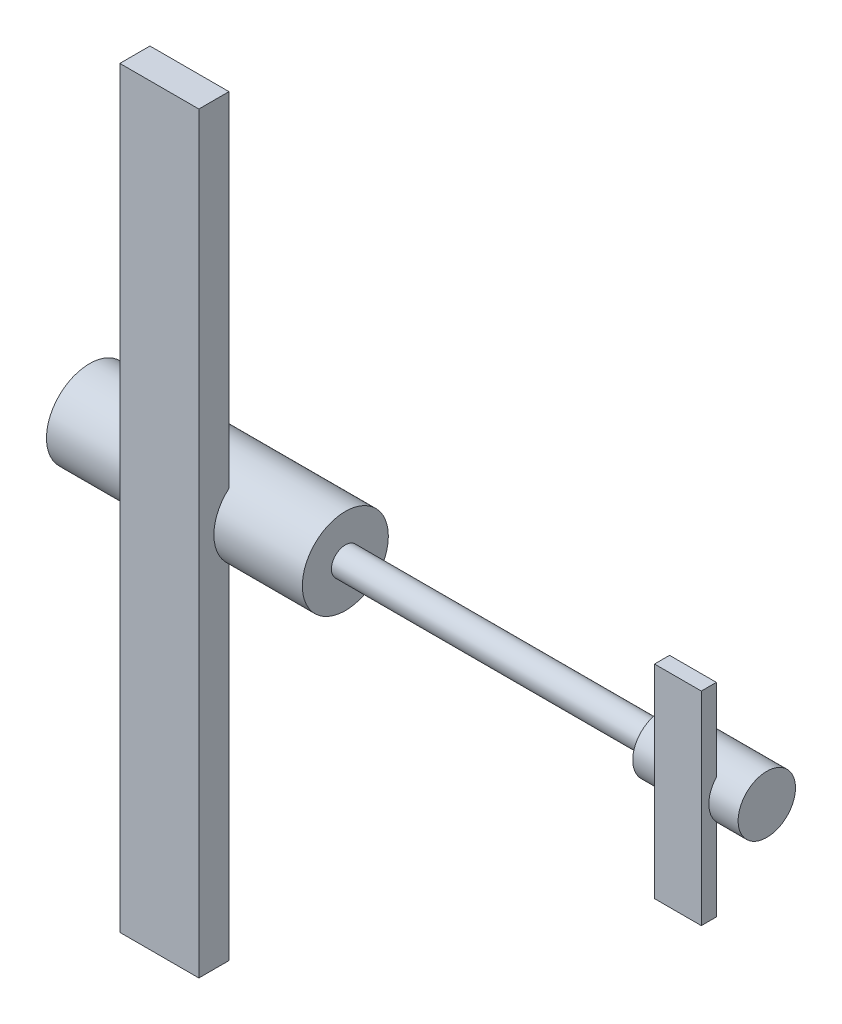
ISO-10303-21;
HEADER;
FILE_DESCRIPTION(('STEP AP214'),'2;1');
FILE_NAME('part.step','',(''),(''),'','','');
FILE_SCHEMA(('AUTOMOTIVE_DESIGN { 1 0 10303 214 1 1 1 1 }'));
ENDSEC;
DATA;
#1=APPLICATION_CONTEXT('core data for automotive mechanical design processes');
#2=APPLICATION_PROTOCOL_DEFINITION('international standard','automotive_design',2000,#1);
#3=PRODUCT_CONTEXT('',#1,'mechanical');
#4=PRODUCT('Part','Part','',(#3));
#5=PRODUCT_RELATED_PRODUCT_CATEGORY('part','',(#4));
#6=PRODUCT_DEFINITION_FORMATION('','',#4);
#7=PRODUCT_DEFINITION_CONTEXT('part definition',#1,'design');
#8=PRODUCT_DEFINITION('design','',#6,#7);
#9=PRODUCT_DEFINITION_SHAPE('','',#8);
#10=(LENGTH_UNIT() NAMED_UNIT(*) SI_UNIT(.MILLI.,.METRE.));
#11=(NAMED_UNIT(*) PLANE_ANGLE_UNIT() SI_UNIT($,.RADIAN.));
#12=(NAMED_UNIT(*) SI_UNIT($,.STERADIAN.) SOLID_ANGLE_UNIT());
#13=UNCERTAINTY_MEASURE_WITH_UNIT(LENGTH_MEASURE(1.E-05),#10,'distance_accuracy_value','');
#14=(GEOMETRIC_REPRESENTATION_CONTEXT(3) GLOBAL_UNCERTAINTY_ASSIGNED_CONTEXT((#13)) GLOBAL_UNIT_ASSIGNED_CONTEXT((#10,
#11,#12)) REPRESENTATION_CONTEXT('',''));
#15=CARTESIAN_POINT('',(0.,0.,0.));
#16=DIRECTION('',(0.,0.,1.));
#17=DIRECTION('',(1.,0.,0.));
#18=AXIS2_PLACEMENT_3D('',#15,#16,#17);
#19=CARTESIAN_POINT('',(900.,0.,0.));
#20=DIRECTION('',(-1.,0.,0.));
#21=DIRECTION('',(0.,0.,1.));
#22=AXIS2_PLACEMENT_3D('',#19,#20,#21);
#23=CYLINDRICAL_SURFACE('',#22,38.1);
#24=CARTESIAN_POINT('',(760.,0.,0.));
#25=DIRECTION('',(1.,0.,0.));
#26=DIRECTION('',(0.,0.,-1.));
#27=AXIS2_PLACEMENT_3D('',#24,#25,#26);
#28=CIRCLE('',#27,38.1);
#29=CARTESIAN_POINT('',(760.,0.,-38.1));
#30=VERTEX_POINT('',#29);
#31=EDGE_CURVE('E210',#30,#30,#28,.T.);
#32=ORIENTED_EDGE('',*,*,#31,.T.);
#33=EDGE_LOOP('',(#32));
#34=FACE_BOUND('',#33,.T.);
#35=CARTESIAN_POINT('',(900.,0.,0.));
#36=DIRECTION('',(1.,0.,0.));
#37=DIRECTION('',(0.,0.,-1.));
#38=AXIS2_PLACEMENT_3D('',#35,#36,#37);
#39=CIRCLE('',#38,38.1);
#40=CARTESIAN_POINT('',(900.,0.,-38.1));
#41=VERTEX_POINT('',#40);
#42=EDGE_CURVE('E211',#41,#41,#39,.T.);
#43=ORIENTED_EDGE('',*,*,#42,.F.);
#44=EDGE_LOOP('',(#43));
#45=FACE_BOUND('',#44,.T.);
#46=DIRECTION('',(-1.,0.,0.));
#47=VECTOR('',#46,1.);
#48=CARTESIAN_POINT('',(900.,25.7293606605372,28.1000000000001));
#49=LINE('',#48,#47);
#50=CARTESIAN_POINT('',(861.1,25.7293606605372,28.1000000000001));
#51=VERTEX_POINT('',#50);
#52=CARTESIAN_POINT('',(798.9,25.7293606605372,28.1000000000001));
#53=VERTEX_POINT('',#52);
#54=EDGE_CURVE('E11',#51,#53,#49,.T.);
#55=ORIENTED_EDGE('',*,*,#54,.F.);
#56=CARTESIAN_POINT('',(861.1,0.,0.));
#57=DIRECTION('',(-1.,0.,0.));
#58=DIRECTION('',(0.,0.,1.));
#59=AXIS2_PLACEMENT_3D('',#56,#57,#58);
#60=CIRCLE('',#59,38.1);
#61=CARTESIAN_POINT('',(861.1,-25.7293606605372,28.1000000000001));
#62=VERTEX_POINT('',#61);
#63=EDGE_CURVE('E254',#62,#51,#60,.T.);
#64=ORIENTED_EDGE('',*,*,#63,.F.);
#65=DIRECTION('',(-1.,0.,0.));
#66=VECTOR('',#65,1.);
#67=CARTESIAN_POINT('',(900.,-25.7293606605372,28.1000000000001));
#68=LINE('',#67,#66);
#69=CARTESIAN_POINT('',(798.9,-25.7293606605372,28.1000000000001));
#70=VERTEX_POINT('',#69);
#71=EDGE_CURVE('E250',#70,#62,#68,.F.);
#72=ORIENTED_EDGE('',*,*,#71,.F.);
#73=CARTESIAN_POINT('',(798.9,0.,0.));
#74=DIRECTION('',(1.,0.,0.));
#75=DIRECTION('',(0.,0.,-1.));
#76=AXIS2_PLACEMENT_3D('',#73,#74,#75);
#77=CIRCLE('',#76,38.1);
#78=EDGE_CURVE('E54',#53,#70,#77,.T.);
#79=ORIENTED_EDGE('',*,*,#78,.F.);
#80=EDGE_LOOP('',(#55,#64,#72,#79));
#81=FACE_BOUND('',#80,.T.);
#82=ADVANCED_FACE('F45',(#34,#45,#81),#23,.T.);
#83=CARTESIAN_POINT('',(340.,0.,0.));
#84=DIRECTION('',(-1.,0.,0.));
#85=DIRECTION('',(0.,0.,1.));
#86=AXIS2_PLACEMENT_3D('',#83,#84,#85);
#87=CYLINDRICAL_SURFACE('',#86,57.15);
#88=CARTESIAN_POINT('',(0.,0.,0.));
#89=DIRECTION('',(1.,0.,0.));
#90=DIRECTION('',(0.,0.,-1.));
#91=AXIS2_PLACEMENT_3D('',#88,#89,#90);
#92=CIRCLE('',#91,57.15);
#93=CARTESIAN_POINT('',(0.,0.,-57.15));
#94=VERTEX_POINT('',#93);
#95=EDGE_CURVE('E222',#94,#94,#92,.T.);
#96=ORIENTED_EDGE('',*,*,#95,.T.);
#97=EDGE_LOOP('',(#96));
#98=FACE_BOUND('',#97,.T.);
#99=CARTESIAN_POINT('',(340.,0.,0.));
#100=DIRECTION('',(1.,0.,0.));
#101=DIRECTION('',(0.,0.,-1.));
#102=AXIS2_PLACEMENT_3D('',#99,#100,#101);
#103=CIRCLE('',#102,57.15);
#104=CARTESIAN_POINT('',(340.,0.,-57.15));
#105=VERTEX_POINT('',#104);
#106=EDGE_CURVE('E228',#105,#105,#103,.T.);
#107=ORIENTED_EDGE('',*,*,#106,.F.);
#108=EDGE_LOOP('',(#107));
#109=FACE_BOUND('',#108,.T.);
#110=DIRECTION('',(-1.,0.,0.));
#111=VECTOR('',#110,1.);
#112=CARTESIAN_POINT('',(340.,43.4281015012169,37.15));
#113=LINE('',#112,#111);
#114=CARTESIAN_POINT('',(222.5,43.4281015012169,37.15));
#115=VERTEX_POINT('',#114);
#116=CARTESIAN_POINT('',(117.5,43.4281015012169,37.15));
#117=VERTEX_POINT('',#116);
#118=EDGE_CURVE('E246',#115,#117,#113,.T.);
#119=ORIENTED_EDGE('',*,*,#118,.F.);
#120=CARTESIAN_POINT('',(222.5,0.,0.));
#121=DIRECTION('',(-1.,0.,0.));
#122=DIRECTION('',(0.,0.,1.));
#123=AXIS2_PLACEMENT_3D('',#120,#121,#122);
#124=CIRCLE('',#123,57.15);
#125=CARTESIAN_POINT('',(222.5,-43.4281015012169,37.15));
#126=VERTEX_POINT('',#125);
#127=EDGE_CURVE('E238',#126,#115,#124,.T.);
#128=ORIENTED_EDGE('',*,*,#127,.F.);
#129=DIRECTION('',(-1.,0.,0.));
#130=VECTOR('',#129,1.);
#131=CARTESIAN_POINT('',(340.,-43.4281015012169,37.15));
#132=LINE('',#131,#130);
#133=CARTESIAN_POINT('',(117.5,-43.4281015012169,37.15));
#134=VERTEX_POINT('',#133);
#135=EDGE_CURVE('E227',#134,#126,#132,.F.);
#136=ORIENTED_EDGE('',*,*,#135,.F.);
#137=CARTESIAN_POINT('',(117.5,0.,0.));
#138=DIRECTION('',(1.,0.,0.));
#139=DIRECTION('',(0.,0.,-1.));
#140=AXIS2_PLACEMENT_3D('',#137,#138,#139);
#141=CIRCLE('',#140,57.15);
#142=EDGE_CURVE('E242',#117,#134,#141,.T.);
#143=ORIENTED_EDGE('',*,*,#142,.F.);
#144=EDGE_LOOP('',(#119,#128,#136,#143));
#145=FACE_BOUND('',#144,.T.);
#146=ADVANCED_FACE('F47',(#98,#109,#145),#87,.T.);
#147=CARTESIAN_POINT('',(340.,0.,0.));
#148=DIRECTION('',(1.,0.,0.));
#149=DIRECTION('',(0.,0.,-1.));
#150=AXIS2_PLACEMENT_3D('',#147,#148,#149);
#151=PLANE('',#150);
#152=CARTESIAN_POINT('',(340.,0.,0.));
#153=DIRECTION('',(1.,0.,0.));
#154=DIRECTION('',(0.,0.,-1.));
#155=AXIS2_PLACEMENT_3D('',#152,#153,#154);
#156=CIRCLE('',#155,18.5392799400319);
#157=CARTESIAN_POINT('',(340.,0.,-18.5392799400319));
#158=VERTEX_POINT('',#157);
#159=EDGE_CURVE('E223',#158,#158,#156,.T.);
#160=ORIENTED_EDGE('',*,*,#159,.F.);
#161=EDGE_LOOP('',(#160));
#162=FACE_BOUND('',#161,.T.);
#163=ORIENTED_EDGE('',*,*,#106,.T.);
#164=EDGE_LOOP('',(#163));
#165=FACE_BOUND('',#164,.T.);
#166=ADVANCED_FACE('F313',(#162,#165),#151,.T.);
#167=CARTESIAN_POINT('',(0.,0.,0.));
#168=DIRECTION('',(1.,0.,0.));
#169=DIRECTION('',(0.,0.,-1.));
#170=AXIS2_PLACEMENT_3D('',#167,#168,#169);
#171=PLANE('',#170);
#172=ORIENTED_EDGE('',*,*,#95,.F.);
#173=EDGE_LOOP('',(#172));
#174=FACE_BOUND('',#173,.T.);
#175=ADVANCED_FACE('F324',(#174),#171,.F.);
#176=CARTESIAN_POINT('',(760.,0.,0.));
#177=DIRECTION('',(-1.,0.,0.));
#178=DIRECTION('',(0.,0.,1.));
#179=AXIS2_PLACEMENT_3D('',#176,#177,#178);
#180=CYLINDRICAL_SURFACE('',#179,18.5392799400319);
#181=CARTESIAN_POINT('',(760.,0.,0.));
#182=DIRECTION('',(1.,0.,0.));
#183=DIRECTION('',(0.,0.,-1.));
#184=AXIS2_PLACEMENT_3D('',#181,#182,#183);
#185=CIRCLE('',#184,18.5392799400319);
#186=CARTESIAN_POINT('',(760.,0.,-18.5392799400319));
#187=VERTEX_POINT('',#186);
#188=EDGE_CURVE('E215',#187,#187,#185,.T.);
#189=ORIENTED_EDGE('',*,*,#188,.F.);
#190=EDGE_LOOP('',(#189));
#191=FACE_BOUND('',#190,.T.);
#192=ORIENTED_EDGE('',*,*,#159,.T.);
#193=EDGE_LOOP('',(#192));
#194=FACE_BOUND('',#193,.T.);
#195=ADVANCED_FACE('F320',(#191,#194),#180,.T.);
#196=CARTESIAN_POINT('',(900.,0.,0.));
#197=DIRECTION('',(1.,0.,0.));
#198=DIRECTION('',(0.,0.,-1.));
#199=AXIS2_PLACEMENT_3D('',#196,#197,#198);
#200=PLANE('',#199);
#201=ORIENTED_EDGE('',*,*,#42,.T.);
#202=EDGE_LOOP('',(#201));
#203=FACE_BOUND('',#202,.T.);
#204=ADVANCED_FACE('F323',(#203),#200,.T.);
#205=CARTESIAN_POINT('',(760.,0.,0.));
#206=DIRECTION('',(1.,0.,0.));
#207=DIRECTION('',(0.,0.,-1.));
#208=AXIS2_PLACEMENT_3D('',#205,#206,#207);
#209=PLANE('',#208);
#210=ORIENTED_EDGE('',*,*,#188,.T.);
#211=EDGE_LOOP('',(#210));
#212=FACE_BOUND('',#211,.T.);
#213=ORIENTED_EDGE('',*,*,#31,.F.);
#214=EDGE_LOOP('',(#213));
#215=FACE_BOUND('',#214,.T.);
#216=ADVANCED_FACE('F318',(#212,#215),#209,.F.);
#217=CARTESIAN_POINT('',(222.5,500.,37.15));
#218=DIRECTION('',(0.,0.,1.));
#219=DIRECTION('',(1.,0.,0.));
#220=AXIS2_PLACEMENT_3D('',#217,#218,#219);
#221=PLANE('',#220);
#222=DIRECTION('',(0.,-1.,0.));
#223=VECTOR('',#222,1.);
#224=CARTESIAN_POINT('',(222.5,500.,37.15));
#225=LINE('',#224,#223);
#226=CARTESIAN_POINT('',(222.5,500.,37.15));
#227=VERTEX_POINT('',#226);
#228=EDGE_CURVE('E198',#227,#115,#225,.T.);
#229=ORIENTED_EDGE('',*,*,#228,.T.);
#230=ORIENTED_EDGE('',*,*,#118,.T.);
#231=DIRECTION('',(0.,-1.,0.));
#232=VECTOR('',#231,1.);
#233=CARTESIAN_POINT('',(117.5,500.,37.15));
#234=LINE('',#233,#232);
#235=CARTESIAN_POINT('',(117.5,500.,37.15));
#236=VERTEX_POINT('',#235);
#237=EDGE_CURVE('E193',#236,#117,#234,.T.);
#238=ORIENTED_EDGE('',*,*,#237,.F.);
#239=DIRECTION('',(-1.,0.,0.));
#240=VECTOR('',#239,1.);
#241=CARTESIAN_POINT('',(222.5,500.,37.15));
#242=LINE('',#241,#240);
#243=EDGE_CURVE('E180',#227,#236,#242,.T.);
#244=ORIENTED_EDGE('',*,*,#243,.F.);
#245=EDGE_LOOP('',(#229,#230,#238,#244));
#246=FACE_BOUND('',#245,.T.);
#247=ADVANCED_FACE('F344',(#246),#221,.F.);
#248=CARTESIAN_POINT('',(117.5,-500.,37.15));
#249=VERTEX_POINT('',#248);
#250=EDGE_CURVE('E182',#134,#249,#234,.T.);
#251=ORIENTED_EDGE('',*,*,#250,.F.);
#252=ORIENTED_EDGE('',*,*,#135,.T.);
#253=CARTESIAN_POINT('',(222.5,-500.,37.15));
#254=VERTEX_POINT('',#253);
#255=EDGE_CURVE('E197',#126,#254,#225,.T.);
#256=ORIENTED_EDGE('',*,*,#255,.T.);
#257=DIRECTION('',(-1.,0.,0.));
#258=VECTOR('',#257,1.);
#259=CARTESIAN_POINT('',(222.5,-500.,37.15));
#260=LINE('',#259,#258);
#261=EDGE_CURVE('E174',#254,#249,#260,.T.);
#262=ORIENTED_EDGE('',*,*,#261,.T.);
#263=EDGE_LOOP('',(#251,#252,#256,#262));
#264=FACE_BOUND('',#263,.T.);
#265=ADVANCED_FACE('F355',(#264),#221,.F.);
#266=CARTESIAN_POINT('',(117.5,500.,37.15));
#267=DIRECTION('',(1.,0.,0.));
#268=DIRECTION('',(0.,0.,-1.));
#269=AXIS2_PLACEMENT_3D('',#266,#267,#268);
#270=PLANE('',#269);
#271=ORIENTED_EDGE('',*,*,#237,.T.);
#272=ORIENTED_EDGE('',*,*,#142,.T.);
#273=ORIENTED_EDGE('',*,*,#250,.T.);
#274=DIRECTION('',(0.,0.,1.));
#275=VECTOR('',#274,1.);
#276=CARTESIAN_POINT('',(117.5,-500.,37.15));
#277=LINE('',#276,#275);
#278=CARTESIAN_POINT('',(117.5,-500.,77.15));
#279=VERTEX_POINT('',#278);
#280=EDGE_CURVE('E158',#249,#279,#277,.T.);
#281=ORIENTED_EDGE('',*,*,#280,.T.);
#282=DIRECTION('',(0.,-1.,0.));
#283=VECTOR('',#282,1.);
#284=CARTESIAN_POINT('',(117.5,500.,77.15));
#285=LINE('',#284,#283);
#286=CARTESIAN_POINT('',(117.5,500.,77.15));
#287=VERTEX_POINT('',#286);
#288=EDGE_CURVE('E206',#287,#279,#285,.T.);
#289=ORIENTED_EDGE('',*,*,#288,.F.);
#290=DIRECTION('',(0.,0.,1.));
#291=VECTOR('',#290,1.);
#292=CARTESIAN_POINT('',(117.5,500.,37.15));
#293=LINE('',#292,#291);
#294=EDGE_CURVE('E169',#236,#287,#293,.T.);
#295=ORIENTED_EDGE('',*,*,#294,.F.);
#296=EDGE_LOOP('',(#271,#272,#273,#281,#289,#295));
#297=FACE_BOUND('',#296,.T.);
#298=ADVANCED_FACE('F359',(#297),#270,.F.);
#299=CARTESIAN_POINT('',(222.5,500.,77.15));
#300=DIRECTION('',(0.,0.,-1.));
#301=DIRECTION('',(-1.,0.,0.));
#302=AXIS2_PLACEMENT_3D('',#299,#300,#301);
#303=PLANE('',#302);
#304=DIRECTION('',(1.,0.,0.));
#305=VECTOR('',#304,1.);
#306=CARTESIAN_POINT('',(222.5,-500.,77.15));
#307=LINE('',#306,#305);
#308=CARTESIAN_POINT('',(222.5,-500.,77.15));
#309=VERTEX_POINT('',#308);
#310=EDGE_CURVE('E163',#279,#309,#307,.T.);
#311=ORIENTED_EDGE('',*,*,#310,.T.);
#312=DIRECTION('',(0.,-1.,0.));
#313=VECTOR('',#312,1.);
#314=CARTESIAN_POINT('',(222.5,500.,77.15));
#315=LINE('',#314,#313);
#316=CARTESIAN_POINT('',(222.5,500.,77.15));
#317=VERTEX_POINT('',#316);
#318=EDGE_CURVE('E202',#317,#309,#315,.T.);
#319=ORIENTED_EDGE('',*,*,#318,.F.);
#320=DIRECTION('',(1.,0.,0.));
#321=VECTOR('',#320,1.);
#322=CARTESIAN_POINT('',(222.5,500.,77.15));
#323=LINE('',#322,#321);
#324=EDGE_CURVE('E173',#287,#317,#323,.T.);
#325=ORIENTED_EDGE('',*,*,#324,.F.);
#326=ORIENTED_EDGE('',*,*,#288,.T.);
#327=EDGE_LOOP('',(#311,#319,#325,#326));
#328=FACE_BOUND('',#327,.T.);
#329=ADVANCED_FACE('F360',(#328),#303,.F.);
#330=CARTESIAN_POINT('',(222.5,500.,37.15));
#331=DIRECTION('',(-1.,0.,0.));
#332=DIRECTION('',(0.,0.,1.));
#333=AXIS2_PLACEMENT_3D('',#330,#331,#332);
#334=PLANE('',#333);
#335=ORIENTED_EDGE('',*,*,#255,.F.);
#336=ORIENTED_EDGE('',*,*,#127,.T.);
#337=ORIENTED_EDGE('',*,*,#228,.F.);
#338=DIRECTION('',(0.,0.,-1.));
#339=VECTOR('',#338,1.);
#340=CARTESIAN_POINT('',(222.5,500.,37.15));
#341=LINE('',#340,#339);
#342=EDGE_CURVE('E177',#317,#227,#341,.T.);
#343=ORIENTED_EDGE('',*,*,#342,.F.);
#344=ORIENTED_EDGE('',*,*,#318,.T.);
#345=DIRECTION('',(0.,0.,-1.));
#346=VECTOR('',#345,1.);
#347=CARTESIAN_POINT('',(222.5,-500.,37.15));
#348=LINE('',#347,#346);
#349=EDGE_CURVE('E186',#309,#254,#348,.T.);
#350=ORIENTED_EDGE('',*,*,#349,.T.);
#351=EDGE_LOOP('',(#335,#336,#337,#343,#344,#350));
#352=FACE_BOUND('',#351,.T.);
#353=ADVANCED_FACE('F341',(#352),#334,.F.);
#354=CARTESIAN_POINT('',(0.,500.,0.));
#355=DIRECTION('',(0.,-1.,0.));
#356=DIRECTION('',(0.,0.,-1.));
#357=AXIS2_PLACEMENT_3D('',#354,#355,#356);
#358=PLANE('',#357);
#359=ORIENTED_EDGE('',*,*,#294,.T.);
#360=ORIENTED_EDGE('',*,*,#324,.T.);
#361=ORIENTED_EDGE('',*,*,#342,.T.);
#362=ORIENTED_EDGE('',*,*,#243,.T.);
#363=EDGE_LOOP('',(#359,#360,#361,#362));
#364=FACE_BOUND('',#363,.T.);
#365=ADVANCED_FACE('F303',(#364),#358,.F.);
#366=CARTESIAN_POINT('',(0.,-500.,0.));
#367=DIRECTION('',(0.,-1.,0.));
#368=DIRECTION('',(0.,0.,-1.));
#369=AXIS2_PLACEMENT_3D('',#366,#367,#368);
#370=PLANE('',#369);
#371=ORIENTED_EDGE('',*,*,#280,.F.);
#372=ORIENTED_EDGE('',*,*,#261,.F.);
#373=ORIENTED_EDGE('',*,*,#349,.F.);
#374=ORIENTED_EDGE('',*,*,#310,.F.);
#375=EDGE_LOOP('',(#371,#372,#373,#374));
#376=FACE_BOUND('',#375,.T.);
#377=ADVANCED_FACE('F296',(#376),#370,.T.);
#378=CARTESIAN_POINT('',(861.1,135.,28.1000000000001));
#379=DIRECTION('',(0.,0.,1.));
#380=DIRECTION('',(1.,0.,0.));
#381=AXIS2_PLACEMENT_3D('',#378,#379,#380);
#382=PLANE('',#381);
#383=DIRECTION('',(0.,-1.,0.));
#384=VECTOR('',#383,1.);
#385=CARTESIAN_POINT('',(861.1,135.,28.1000000000001));
#386=LINE('',#385,#384);
#387=CARTESIAN_POINT('',(861.1,135.,28.1000000000001));
#388=VERTEX_POINT('',#387);
#389=EDGE_CURVE('E165',#388,#51,#386,.T.);
#390=ORIENTED_EDGE('',*,*,#389,.T.);
#391=ORIENTED_EDGE('',*,*,#54,.T.);
#392=DIRECTION('',(0.,-1.,0.));
#393=VECTOR('',#392,1.);
#394=CARTESIAN_POINT('',(798.9,135.,28.1000000000001));
#395=LINE('',#394,#393);
#396=CARTESIAN_POINT('',(798.9,135.,28.1000000000001));
#397=VERTEX_POINT('',#396);
#398=EDGE_CURVE('E260',#397,#53,#395,.T.);
#399=ORIENTED_EDGE('',*,*,#398,.F.);
#400=DIRECTION('',(-1.,0.,0.));
#401=VECTOR('',#400,1.);
#402=CARTESIAN_POINT('',(861.1,135.,28.1000000000001));
#403=LINE('',#402,#401);
#404=EDGE_CURVE('E147',#388,#397,#403,.T.);
#405=ORIENTED_EDGE('',*,*,#404,.F.);
#406=EDGE_LOOP('',(#390,#391,#399,#405));
#407=FACE_BOUND('',#406,.T.);
#408=ADVANCED_FACE('F294',(#407),#382,.F.);
#409=CARTESIAN_POINT('',(798.9,-135.,28.1000000000001));
#410=VERTEX_POINT('',#409);
#411=EDGE_CURVE('E258',#70,#410,#395,.T.);
#412=ORIENTED_EDGE('',*,*,#411,.F.);
#413=ORIENTED_EDGE('',*,*,#71,.T.);
#414=CARTESIAN_POINT('',(861.1,-135.,28.1000000000001));
#415=VERTEX_POINT('',#414);
#416=EDGE_CURVE('E269',#62,#415,#386,.T.);
#417=ORIENTED_EDGE('',*,*,#416,.T.);
#418=DIRECTION('',(-1.,0.,0.));
#419=VECTOR('',#418,1.);
#420=CARTESIAN_POINT('',(861.1,-135.,28.1000000000001));
#421=LINE('',#420,#419);
#422=EDGE_CURVE('E152',#415,#410,#421,.T.);
#423=ORIENTED_EDGE('',*,*,#422,.T.);
#424=EDGE_LOOP('',(#412,#413,#417,#423));
#425=FACE_BOUND('',#424,.T.);
#426=ADVANCED_FACE('F262',(#425),#382,.F.);
#427=CARTESIAN_POINT('',(798.9,135.,28.1000000000001));
#428=DIRECTION('',(1.,0.,0.));
#429=DIRECTION('',(0.,0.,-1.));
#430=AXIS2_PLACEMENT_3D('',#427,#428,#429);
#431=PLANE('',#430);
#432=ORIENTED_EDGE('',*,*,#398,.T.);
#433=ORIENTED_EDGE('',*,*,#78,.T.);
#434=ORIENTED_EDGE('',*,*,#411,.T.);
#435=DIRECTION('',(0.,0.,1.));
#436=VECTOR('',#435,1.);
#437=CARTESIAN_POINT('',(798.9,-135.,28.1000000000001));
#438=LINE('',#437,#436);
#439=CARTESIAN_POINT('',(798.9,-135.,48.1000000000001));
#440=VERTEX_POINT('',#439);
#441=EDGE_CURVE('E156',#410,#440,#438,.T.);
#442=ORIENTED_EDGE('',*,*,#441,.T.);
#443=DIRECTION('',(0.,-1.,0.));
#444=VECTOR('',#443,1.);
#445=CARTESIAN_POINT('',(798.9,135.,48.1000000000001));
#446=LINE('',#445,#444);
#447=CARTESIAN_POINT('',(798.9,135.,48.1000000000001));
#448=VERTEX_POINT('',#447);
#449=EDGE_CURVE('E134',#448,#440,#446,.T.);
#450=ORIENTED_EDGE('',*,*,#449,.F.);
#451=DIRECTION('',(0.,0.,1.));
#452=VECTOR('',#451,1.);
#453=CARTESIAN_POINT('',(798.9,135.,28.1000000000001));
#454=LINE('',#453,#452);
#455=EDGE_CURVE('E142',#397,#448,#454,.T.);
#456=ORIENTED_EDGE('',*,*,#455,.F.);
#457=EDGE_LOOP('',(#432,#433,#434,#442,#450,#456));
#458=FACE_BOUND('',#457,.T.);
#459=ADVANCED_FACE('F154',(#458),#431,.F.);
#460=CARTESIAN_POINT('',(861.1,135.,48.1000000000001));
#461=DIRECTION('',(0.,0.,-1.));
#462=DIRECTION('',(-1.,0.,0.));
#463=AXIS2_PLACEMENT_3D('',#460,#461,#462);
#464=PLANE('',#463);
#465=DIRECTION('',(1.,0.,0.));
#466=VECTOR('',#465,1.);
#467=CARTESIAN_POINT('',(861.1,-135.,48.1000000000001));
#468=LINE('',#467,#466);
#469=CARTESIAN_POINT('',(861.1,-135.,48.1000000000001));
#470=VERTEX_POINT('',#469);
#471=EDGE_CURVE('E285',#440,#470,#468,.T.);
#472=ORIENTED_EDGE('',*,*,#471,.T.);
#473=DIRECTION('',(0.,-1.,0.));
#474=VECTOR('',#473,1.);
#475=CARTESIAN_POINT('',(861.1,135.,48.1000000000001));
#476=LINE('',#475,#474);
#477=CARTESIAN_POINT('',(861.1,135.,48.1000000000001));
#478=VERTEX_POINT('',#477);
#479=EDGE_CURVE('E137',#478,#470,#476,.T.);
#480=ORIENTED_EDGE('',*,*,#479,.F.);
#481=DIRECTION('',(1.,0.,0.));
#482=VECTOR('',#481,1.);
#483=CARTESIAN_POINT('',(861.1,135.,48.1000000000001));
#484=LINE('',#483,#482);
#485=EDGE_CURVE('E130',#448,#478,#484,.T.);
#486=ORIENTED_EDGE('',*,*,#485,.F.);
#487=ORIENTED_EDGE('',*,*,#449,.T.);
#488=EDGE_LOOP('',(#472,#480,#486,#487));
#489=FACE_BOUND('',#488,.T.);
#490=ADVANCED_FACE('F132',(#489),#464,.F.);
#491=CARTESIAN_POINT('',(861.1,135.,28.1000000000001));
#492=DIRECTION('',(-1.,0.,0.));
#493=DIRECTION('',(0.,0.,1.));
#494=AXIS2_PLACEMENT_3D('',#491,#492,#493);
#495=PLANE('',#494);
#496=ORIENTED_EDGE('',*,*,#416,.F.);
#497=ORIENTED_EDGE('',*,*,#63,.T.);
#498=ORIENTED_EDGE('',*,*,#389,.F.);
#499=DIRECTION('',(0.,0.,-1.));
#500=VECTOR('',#499,1.);
#501=CARTESIAN_POINT('',(861.1,135.,28.1000000000001));
#502=LINE('',#501,#500);
#503=EDGE_CURVE('E141',#478,#388,#502,.T.);
#504=ORIENTED_EDGE('',*,*,#503,.F.);
#505=ORIENTED_EDGE('',*,*,#479,.T.);
#506=DIRECTION('',(0.,0.,-1.));
#507=VECTOR('',#506,1.);
#508=CARTESIAN_POINT('',(861.1,-135.,28.1000000000001));
#509=LINE('',#508,#507);
#510=EDGE_CURVE('E281',#470,#415,#509,.T.);
#511=ORIENTED_EDGE('',*,*,#510,.T.);
#512=EDGE_LOOP('',(#496,#497,#498,#504,#505,#511));
#513=FACE_BOUND('',#512,.T.);
#514=ADVANCED_FACE('F282',(#513),#495,.F.);
#515=CARTESIAN_POINT('',(0.,135.,0.));
#516=DIRECTION('',(0.,-1.,0.));
#517=DIRECTION('',(0.,0.,-1.));
#518=AXIS2_PLACEMENT_3D('',#515,#516,#517);
#519=PLANE('',#518);
#520=ORIENTED_EDGE('',*,*,#455,.T.);
#521=ORIENTED_EDGE('',*,*,#485,.T.);
#522=ORIENTED_EDGE('',*,*,#503,.T.);
#523=ORIENTED_EDGE('',*,*,#404,.T.);
#524=EDGE_LOOP('',(#520,#521,#522,#523));
#525=FACE_BOUND('',#524,.T.);
#526=ADVANCED_FACE('F145',(#525),#519,.F.);
#527=CARTESIAN_POINT('',(0.,-135.,0.));
#528=DIRECTION('',(0.,-1.,0.));
#529=DIRECTION('',(0.,0.,-1.));
#530=AXIS2_PLACEMENT_3D('',#527,#528,#529);
#531=PLANE('',#530);
#532=ORIENTED_EDGE('',*,*,#441,.F.);
#533=ORIENTED_EDGE('',*,*,#422,.F.);
#534=ORIENTED_EDGE('',*,*,#510,.F.);
#535=ORIENTED_EDGE('',*,*,#471,.F.);
#536=EDGE_LOOP('',(#532,#533,#534,#535));
#537=FACE_BOUND('',#536,.T.);
#538=ADVANCED_FACE('F286',(#537),#531,.T.);
#539=CLOSED_SHELL('',(#82,#146,#166,#175,#195,#204,#216,#247,#265,#298,#329,#353,#365,#377,#408,
#426,#459,#490,#514,#526,#538));
#540=MANIFOLD_SOLID_BREP('B2',#539);
#541=ADVANCED_BREP_SHAPE_REPRESENTATION('',(#18,#540),#14);
#542=SHAPE_DEFINITION_REPRESENTATION(#9,#541);
ENDSEC;
END-ISO-10303-21;
